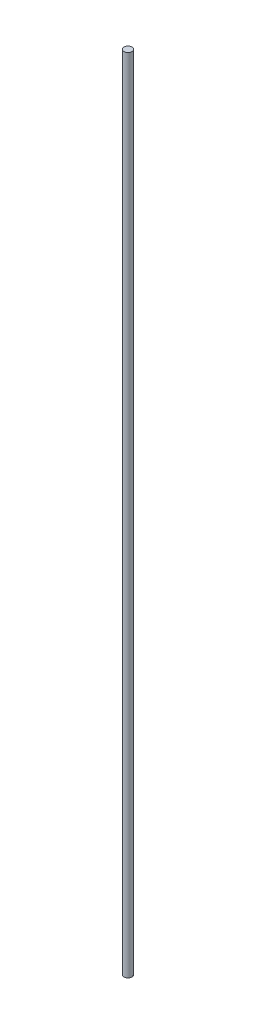
ISO-10303-21;
HEADER;
FILE_DESCRIPTION(('STEP AP214'),'2;1');
FILE_NAME('part.step','',(''),(''),'','','');
FILE_SCHEMA(('AUTOMOTIVE_DESIGN { 1 0 10303 214 1 1 1 1 }'));
ENDSEC;
DATA;
#1=APPLICATION_CONTEXT('core data for automotive mechanical design processes');
#2=APPLICATION_PROTOCOL_DEFINITION('international standard','automotive_design',2000,#1);
#3=PRODUCT_CONTEXT('',#1,'mechanical');
#4=PRODUCT('Part','Part','',(#3));
#5=PRODUCT_RELATED_PRODUCT_CATEGORY('part','',(#4));
#6=PRODUCT_DEFINITION_FORMATION('','',#4);
#7=PRODUCT_DEFINITION_CONTEXT('part definition',#1,'design');
#8=PRODUCT_DEFINITION('design','',#6,#7);
#9=PRODUCT_DEFINITION_SHAPE('','',#8);
#10=(LENGTH_UNIT() NAMED_UNIT(*) SI_UNIT(.MILLI.,.METRE.));
#11=(NAMED_UNIT(*) PLANE_ANGLE_UNIT() SI_UNIT($,.RADIAN.));
#12=(NAMED_UNIT(*) SI_UNIT($,.STERADIAN.) SOLID_ANGLE_UNIT());
#13=UNCERTAINTY_MEASURE_WITH_UNIT(LENGTH_MEASURE(1.E-05),#10,'distance_accuracy_value','');
#14=(GEOMETRIC_REPRESENTATION_CONTEXT(3) GLOBAL_UNCERTAINTY_ASSIGNED_CONTEXT((#13)) GLOBAL_UNIT_ASSIGNED_CONTEXT((#10,
#11,#12)) REPRESENTATION_CONTEXT('',''));
#15=CARTESIAN_POINT('',(0.,0.,0.));
#16=DIRECTION('',(0.,0.,1.));
#17=DIRECTION('',(1.,0.,0.));
#18=AXIS2_PLACEMENT_3D('',#15,#16,#17);
#19=CARTESIAN_POINT('',(0.,-400.,0.));
#20=DIRECTION('',(0.,1.,0.));
#21=DIRECTION('',(0.,0.,1.));
#22=AXIS2_PLACEMENT_3D('',#19,#20,#21);
#23=CYLINDRICAL_SURFACE('',#22,4.);
#24=CARTESIAN_POINT('',(0.,-400.,0.));
#25=DIRECTION('',(0.,1.,0.));
#26=DIRECTION('',(0.,0.,1.));
#27=AXIS2_PLACEMENT_3D('',#24,#25,#26);
#28=CIRCLE('',#27,4.);
#29=CARTESIAN_POINT('',(0.,-400.,4.));
#30=VERTEX_POINT('',#29);
#31=EDGE_CURVE('E10',#30,#30,#28,.T.);
#32=ORIENTED_EDGE('',*,*,#31,.T.);
#33=EDGE_LOOP('',(#32));
#34=FACE_BOUND('',#33,.T.);
#35=CARTESIAN_POINT('',(0.,400.,0.));
#36=DIRECTION('',(0.,1.,0.));
#37=DIRECTION('',(0.,0.,1.));
#38=AXIS2_PLACEMENT_3D('',#35,#36,#37);
#39=CIRCLE('',#38,4.);
#40=CARTESIAN_POINT('',(0.,400.,4.));
#41=VERTEX_POINT('',#40);
#42=EDGE_CURVE('E42',#41,#41,#39,.T.);
#43=ORIENTED_EDGE('',*,*,#42,.F.);
#44=EDGE_LOOP('',(#43));
#45=FACE_BOUND('',#44,.T.);
#46=ADVANCED_FACE('F36',(#34,#45),#23,.T.);
#47=CARTESIAN_POINT('',(0.,-400.,0.));
#48=DIRECTION('',(0.,1.,0.));
#49=DIRECTION('',(0.,0.,1.));
#50=AXIS2_PLACEMENT_3D('',#47,#48,#49);
#51=PLANE('',#50);
#52=ORIENTED_EDGE('',*,*,#31,.F.);
#53=EDGE_LOOP('',(#52));
#54=FACE_BOUND('',#53,.T.);
#55=ADVANCED_FACE('F51',(#54),#51,.F.);
#56=CARTESIAN_POINT('',(0.,400.,0.));
#57=DIRECTION('',(0.,1.,0.));
#58=DIRECTION('',(0.,0.,1.));
#59=AXIS2_PLACEMENT_3D('',#56,#57,#58);
#60=PLANE('',#59);
#61=ORIENTED_EDGE('',*,*,#42,.T.);
#62=EDGE_LOOP('',(#61));
#63=FACE_BOUND('',#62,.T.);
#64=ADVANCED_FACE('F48',(#63),#60,.T.);
#65=CLOSED_SHELL('',(#46,#55,#64));
#66=MANIFOLD_SOLID_BREP('B2',#65);
#67=ADVANCED_BREP_SHAPE_REPRESENTATION('',(#18,#66),#14);
#68=SHAPE_DEFINITION_REPRESENTATION(#9,#67);
ENDSEC;
END-ISO-10303-21;
